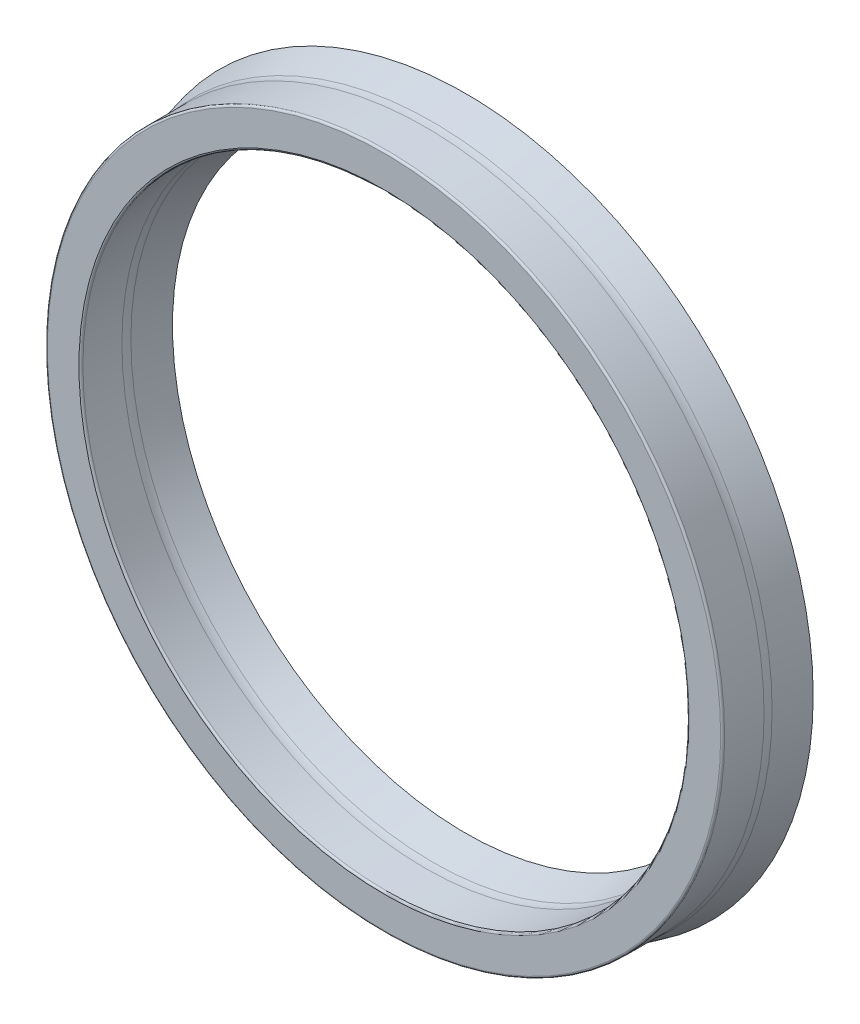
ISO-10303-21;
HEADER;
FILE_DESCRIPTION(('STEP AP214'),'2;1');
FILE_NAME('part.step','',(''),(''),'','','');
FILE_SCHEMA(('AUTOMOTIVE_DESIGN { 1 0 10303 214 1 1 1 1 }'));
ENDSEC;
DATA;
#1=APPLICATION_CONTEXT('core data for automotive mechanical design processes');
#2=APPLICATION_PROTOCOL_DEFINITION('international standard','automotive_design',2000,#1);
#3=PRODUCT_CONTEXT('',#1,'mechanical');
#4=PRODUCT('Part','Part','',(#3));
#5=PRODUCT_RELATED_PRODUCT_CATEGORY('part','',(#4));
#6=PRODUCT_DEFINITION_FORMATION('','',#4);
#7=PRODUCT_DEFINITION_CONTEXT('part definition',#1,'design');
#8=PRODUCT_DEFINITION('design','',#6,#7);
#9=PRODUCT_DEFINITION_SHAPE('','',#8);
#10=(LENGTH_UNIT() NAMED_UNIT(*) SI_UNIT(.MILLI.,.METRE.));
#11=(NAMED_UNIT(*) PLANE_ANGLE_UNIT() SI_UNIT($,.RADIAN.));
#12=(NAMED_UNIT(*) SI_UNIT($,.STERADIAN.) SOLID_ANGLE_UNIT());
#13=UNCERTAINTY_MEASURE_WITH_UNIT(LENGTH_MEASURE(1.E-05),#10,'distance_accuracy_value','');
#14=(GEOMETRIC_REPRESENTATION_CONTEXT(3) GLOBAL_UNCERTAINTY_ASSIGNED_CONTEXT((#13)) GLOBAL_UNIT_ASSIGNED_CONTEXT((#10,
#11,#12)) REPRESENTATION_CONTEXT('',''));
#15=CARTESIAN_POINT('',(0.,0.,0.));
#16=DIRECTION('',(0.,0.,1.));
#17=DIRECTION('',(1.,0.,0.));
#18=AXIS2_PLACEMENT_3D('',#15,#16,#17);
#19=CARTESIAN_POINT('',(0.,34.75,-8.15));
#20=DIRECTION('',(0.,0.,1.));
#21=DIRECTION('',(1.,0.,0.));
#22=AXIS2_PLACEMENT_3D('',#19,#20,#21);
#23=PLANE('',#22);
#24=CARTESIAN_POINT('',(0.,0.,-8.15));
#25=DIRECTION('',(0.,0.,1.));
#26=DIRECTION('',(1.,0.,0.));
#27=AXIS2_PLACEMENT_3D('',#24,#25,#26);
#28=CIRCLE('',#27,34.75);
#29=CARTESIAN_POINT('',(34.75,0.,-8.15));
#30=VERTEX_POINT('',#29);
#31=EDGE_CURVE('E10',#30,#30,#28,.T.);
#32=ORIENTED_EDGE('',*,*,#31,.F.);
#33=EDGE_LOOP('',(#32));
#34=FACE_BOUND('',#33,.T.);
#35=CARTESIAN_POINT('',(0.,0.,-8.15));
#36=DIRECTION('',(0.,0.,1.));
#37=DIRECTION('',(1.,0.,0.));
#38=AXIS2_PLACEMENT_3D('',#35,#36,#37);
#39=CIRCLE('',#38,33.5);
#40=CARTESIAN_POINT('',(33.5,0.,-8.15));
#41=VERTEX_POINT('',#40);
#42=EDGE_CURVE('E85',#41,#41,#39,.T.);
#43=ORIENTED_EDGE('',*,*,#42,.T.);
#44=EDGE_LOOP('',(#43));
#45=FACE_BOUND('',#44,.T.);
#46=ADVANCED_FACE('F39',(#34,#45),#23,.F.);
#47=CARTESIAN_POINT('',(0.,0.,-8.15));
#48=DIRECTION('',(0.,0.,-1.));
#49=DIRECTION('',(-1.,0.,0.));
#50=AXIS2_PLACEMENT_3D('',#47,#48,#49);
#51=CONICAL_SURFACE('',#50,34.75,0.241752867864243);
#52=CARTESIAN_POINT('',(0.,0.,-4.85380883804575));
#53=DIRECTION('',(0.,0.,1.));
#54=DIRECTION('',(1.,0.,0.));
#55=AXIS2_PLACEMENT_3D('',#52,#53,#54);
#56=CIRCLE('',#55,33.9372405354085);
#57=CARTESIAN_POINT('',(33.9372405354085,0.,-4.85380883804575));
#58=VERTEX_POINT('',#57);
#59=EDGE_CURVE('E45',#58,#58,#56,.T.);
#60=ORIENTED_EDGE('',*,*,#59,.F.);
#61=EDGE_LOOP('',(#60));
#62=FACE_BOUND('',#61,.T.);
#63=ORIENTED_EDGE('',*,*,#31,.T.);
#64=EDGE_LOOP('',(#63));
#65=FACE_BOUND('',#64,.T.);
#66=ADVANCED_FACE('F158',(#62,#65),#51,.T.);
#67=CARTESIAN_POINT('',(0.,0.,-4.13559417554377));
#68=DIRECTION('',(0.,0.,1.));
#69=DIRECTION('',(1.,0.,0.));
#70=AXIS2_PLACEMENT_3D('',#67,#68,#69);
#71=TOROIDAL_SURFACE('',#70,36.85,3.);
#72=CARTESIAN_POINT('',(0.,0.,-4.13559417554374));
#73=DIRECTION('',(0.,0.,1.));
#74=DIRECTION('',(1.,0.,0.));
#75=AXIS2_PLACEMENT_3D('',#72,#73,#74);
#76=CIRCLE('',#75,33.85);
#77=CARTESIAN_POINT('',(33.85,0.,-4.13559417554374));
#78=VERTEX_POINT('',#77);
#79=EDGE_CURVE('E49',#78,#78,#76,.T.);
#80=ORIENTED_EDGE('',*,*,#79,.F.);
#81=EDGE_LOOP('',(#80));
#82=FACE_BOUND('',#81,.T.);
#83=ORIENTED_EDGE('',*,*,#59,.T.);
#84=EDGE_LOOP('',(#83));
#85=FACE_BOUND('',#84,.T.);
#86=ADVANCED_FACE('F153',(#82,#85),#71,.F.);
#87=CARTESIAN_POINT('',(0.,0.,0.));
#88=DIRECTION('',(0.,0.,1.));
#89=DIRECTION('',(1.,0.,0.));
#90=AXIS2_PLACEMENT_3D('',#87,#88,#89);
#91=CYLINDRICAL_SURFACE('',#90,33.85);
#92=CARTESIAN_POINT('',(0.,0.,-0.2));
#93=DIRECTION('',(0.,0.,1.));
#94=DIRECTION('',(1.,0.,0.));
#95=AXIS2_PLACEMENT_3D('',#92,#93,#94);
#96=CIRCLE('',#95,33.85);
#97=CARTESIAN_POINT('',(33.85,0.,-0.2));
#98=VERTEX_POINT('',#97);
#99=EDGE_CURVE('E53',#98,#98,#96,.T.);
#100=ORIENTED_EDGE('',*,*,#99,.F.);
#101=EDGE_LOOP('',(#100));
#102=FACE_BOUND('',#101,.T.);
#103=ORIENTED_EDGE('',*,*,#79,.T.);
#104=EDGE_LOOP('',(#103));
#105=FACE_BOUND('',#104,.T.);
#106=ADVANCED_FACE('F147',(#102,#105),#91,.T.);
#107=CARTESIAN_POINT('',(0.,0.,-0.2));
#108=DIRECTION('',(0.,0.,1.));
#109=DIRECTION('',(1.,0.,0.));
#110=AXIS2_PLACEMENT_3D('',#107,#108,#109);
#111=TOROIDAL_SURFACE('',#110,33.65,0.199999999999999);
#112=CARTESIAN_POINT('',(0.,0.,0.));
#113=DIRECTION('',(0.,0.,1.));
#114=DIRECTION('',(1.,0.,0.));
#115=AXIS2_PLACEMENT_3D('',#112,#113,#114);
#116=CIRCLE('',#115,33.65);
#117=CARTESIAN_POINT('',(33.65,0.,0.));
#118=VERTEX_POINT('',#117);
#119=EDGE_CURVE('E58',#118,#118,#116,.T.);
#120=ORIENTED_EDGE('',*,*,#119,.F.);
#121=EDGE_LOOP('',(#120));
#122=FACE_BOUND('',#121,.T.);
#123=ORIENTED_EDGE('',*,*,#99,.T.);
#124=EDGE_LOOP('',(#123));
#125=FACE_BOUND('',#124,.T.);
#126=ADVANCED_FACE('F141',(#122,#125),#111,.T.);
#127=CARTESIAN_POINT('',(0.,30.5,0.));
#128=DIRECTION('',(0.,0.,-1.));
#129=DIRECTION('',(-1.,0.,0.));
#130=AXIS2_PLACEMENT_3D('',#127,#128,#129);
#131=PLANE('',#130);
#132=CARTESIAN_POINT('',(0.,0.,0.));
#133=DIRECTION('',(0.,0.,1.));
#134=DIRECTION('',(1.,0.,0.));
#135=AXIS2_PLACEMENT_3D('',#132,#133,#134);
#136=CIRCLE('',#135,30.5);
#137=CARTESIAN_POINT('',(30.5,0.,0.));
#138=VERTEX_POINT('',#137);
#139=EDGE_CURVE('E61',#138,#138,#136,.T.);
#140=ORIENTED_EDGE('',*,*,#139,.F.);
#141=EDGE_LOOP('',(#140));
#142=FACE_BOUND('',#141,.T.);
#143=ORIENTED_EDGE('',*,*,#119,.T.);
#144=EDGE_LOOP('',(#143));
#145=FACE_BOUND('',#144,.T.);
#146=ADVANCED_FACE('F135',(#142,#145),#131,.F.);
#147=CARTESIAN_POINT('',(0.,0.,-0.2));
#148=DIRECTION('',(0.,0.,1.));
#149=DIRECTION('',(1.,0.,0.));
#150=AXIS2_PLACEMENT_3D('',#147,#148,#149);
#151=TOROIDAL_SURFACE('',#150,30.5,0.199999999999996);
#152=CARTESIAN_POINT('',(0.,0.,-0.2));
#153=DIRECTION('',(0.,0.,1.));
#154=DIRECTION('',(1.,0.,0.));
#155=AXIS2_PLACEMENT_3D('',#152,#153,#154);
#156=CIRCLE('',#155,30.3);
#157=CARTESIAN_POINT('',(30.3,0.,-0.2));
#158=VERTEX_POINT('',#157);
#159=EDGE_CURVE('E64',#158,#158,#156,.T.);
#160=ORIENTED_EDGE('',*,*,#159,.F.);
#161=EDGE_LOOP('',(#160));
#162=FACE_BOUND('',#161,.T.);
#163=ORIENTED_EDGE('',*,*,#139,.T.);
#164=EDGE_LOOP('',(#163));
#165=FACE_BOUND('',#164,.T.);
#166=ADVANCED_FACE('F129',(#162,#165),#151,.T.);
#167=CARTESIAN_POINT('',(0.,0.,0.));
#168=DIRECTION('',(0.,0.,1.));
#169=DIRECTION('',(1.,0.,0.));
#170=AXIS2_PLACEMENT_3D('',#167,#168,#169);
#171=CYLINDRICAL_SURFACE('',#170,30.3);
#172=CARTESIAN_POINT('',(0.,0.,-4.09647631790024));
#173=DIRECTION('',(0.,0.,1.));
#174=DIRECTION('',(1.,0.,0.));
#175=AXIS2_PLACEMENT_3D('',#172,#173,#174);
#176=CIRCLE('',#175,30.3);
#177=CARTESIAN_POINT('',(30.3,0.,-4.09647631790024));
#178=VERTEX_POINT('',#177);
#179=EDGE_CURVE('E67',#178,#178,#176,.T.);
#180=ORIENTED_EDGE('',*,*,#179,.F.);
#181=EDGE_LOOP('',(#180));
#182=FACE_BOUND('',#181,.T.);
#183=ORIENTED_EDGE('',*,*,#159,.T.);
#184=EDGE_LOOP('',(#183));
#185=FACE_BOUND('',#184,.T.);
#186=ADVANCED_FACE('F123',(#182,#185),#171,.F.);
#187=CARTESIAN_POINT('',(0.,0.,-4.09647631790024));
#188=DIRECTION('',(0.,0.,1.));
#189=DIRECTION('',(1.,0.,0.));
#190=AXIS2_PLACEMENT_3D('',#187,#188,#189);
#191=TOROIDAL_SURFACE('',#190,27.3,3.);
#192=CARTESIAN_POINT('',(0.,0.,-4.88918175913604));
#193=DIRECTION('',(0.,0.,1.));
#194=DIRECTION('',(1.,0.,0.));
#195=AXIS2_PLACEMENT_3D('',#192,#193,#194);
#196=CIRCLE('',#195,30.1933748605107);
#197=CARTESIAN_POINT('',(30.1933748605107,0.,-4.88918175913604));
#198=VERTEX_POINT('',#197);
#199=EDGE_CURVE('E70',#198,#198,#196,.T.);
#200=ORIENTED_EDGE('',*,*,#199,.F.);
#201=EDGE_LOOP('',(#200));
#202=FACE_BOUND('',#201,.T.);
#203=ORIENTED_EDGE('',*,*,#179,.T.);
#204=EDGE_LOOP('',(#203));
#205=FACE_BOUND('',#204,.T.);
#206=ADVANCED_FACE('F117',(#202,#205),#191,.F.);
#207=CARTESIAN_POINT('',(0.,0.,-4.88918175913604));
#208=DIRECTION('',(0.,0.,1.));
#209=DIRECTION('',(1.,0.,0.));
#210=AXIS2_PLACEMENT_3D('',#207,#208,#209);
#211=CONICAL_SURFACE('',#210,30.1933748605107,0.267410797183873);
#212=CARTESIAN_POINT('',(0.,0.,-8.15));
#213=DIRECTION('',(0.,0.,1.));
#214=DIRECTION('',(1.,0.,0.));
#215=AXIS2_PLACEMENT_3D('',#212,#213,#214);
#216=CIRCLE('',#215,29.3);
#217=CARTESIAN_POINT('',(29.3,0.,-8.15));
#218=VERTEX_POINT('',#217);
#219=EDGE_CURVE('E73',#218,#218,#216,.T.);
#220=ORIENTED_EDGE('',*,*,#219,.F.);
#221=EDGE_LOOP('',(#220));
#222=FACE_BOUND('',#221,.T.);
#223=ORIENTED_EDGE('',*,*,#199,.T.);
#224=EDGE_LOOP('',(#223));
#225=FACE_BOUND('',#224,.T.);
#226=ADVANCED_FACE('F111',(#222,#225),#211,.F.);
#227=CARTESIAN_POINT('',(0.,30.75,-8.15));
#228=DIRECTION('',(0.,0.,1.));
#229=DIRECTION('',(1.,0.,0.));
#230=AXIS2_PLACEMENT_3D('',#227,#228,#229);
#231=PLANE('',#230);
#232=CARTESIAN_POINT('',(0.,0.,-8.15));
#233=DIRECTION('',(0.,0.,1.));
#234=DIRECTION('',(1.,0.,0.));
#235=AXIS2_PLACEMENT_3D('',#232,#233,#234);
#236=CIRCLE('',#235,30.75);
#237=CARTESIAN_POINT('',(30.75,0.,-8.15));
#238=VERTEX_POINT('',#237);
#239=EDGE_CURVE('E76',#238,#238,#236,.T.);
#240=ORIENTED_EDGE('',*,*,#239,.F.);
#241=EDGE_LOOP('',(#240));
#242=FACE_BOUND('',#241,.T.);
#243=ORIENTED_EDGE('',*,*,#219,.T.);
#244=EDGE_LOOP('',(#243));
#245=FACE_BOUND('',#244,.T.);
#246=ADVANCED_FACE('F105',(#242,#245),#231,.F.);
#247=CARTESIAN_POINT('',(0.,0.,-8.15));
#248=DIRECTION('',(0.,0.,1.));
#249=DIRECTION('',(1.,0.,0.));
#250=AXIS2_PLACEMENT_3D('',#247,#248,#249);
#251=CONICAL_SURFACE('',#250,30.75,0.255057918494361);
#252=CARTESIAN_POINT('',(0.,0.,-4.9238492730938));
#253=DIRECTION('',(0.,0.,1.));
#254=DIRECTION('',(1.,0.,0.));
#255=AXIS2_PLACEMENT_3D('',#252,#253,#254);
#256=CIRCLE('',#255,31.5911756578044);
#257=CARTESIAN_POINT('',(31.5911756578044,0.,-4.9238492730938));
#258=VERTEX_POINT('',#257);
#259=EDGE_CURVE('E79',#258,#258,#256,.T.);
#260=ORIENTED_EDGE('',*,*,#259,.F.);
#261=EDGE_LOOP('',(#260));
#262=FACE_BOUND('',#261,.T.);
#263=ORIENTED_EDGE('',*,*,#239,.T.);
#264=EDGE_LOOP('',(#263));
#265=FACE_BOUND('',#264,.T.);
#266=ADVANCED_FACE('F99',(#262,#265),#251,.T.);
#267=CARTESIAN_POINT('',(0.,0.,-5.05));
#268=DIRECTION('',(0.,0.,1.));
#269=DIRECTION('',(1.,0.,0.));
#270=AXIS2_PLACEMENT_3D('',#267,#268,#269);
#271=TOROIDAL_SURFACE('',#270,32.075,0.5);
#272=CARTESIAN_POINT('',(0.,0.,-4.91));
#273=DIRECTION('',(0.,0.,1.));
#274=DIRECTION('',(1.,0.,0.));
#275=AXIS2_PLACEMENT_3D('',#272,#273,#274);
#276=CIRCLE('',#275,32.555);
#277=CARTESIAN_POINT('',(32.555,0.,-4.91));
#278=VERTEX_POINT('',#277);
#279=EDGE_CURVE('E82',#278,#278,#276,.T.);
#280=ORIENTED_EDGE('',*,*,#279,.F.);
#281=EDGE_LOOP('',(#280));
#282=FACE_BOUND('',#281,.T.);
#283=ORIENTED_EDGE('',*,*,#259,.T.);
#284=EDGE_LOOP('',(#283));
#285=FACE_BOUND('',#284,.T.);
#286=ADVANCED_FACE('F93',(#282,#285),#271,.F.);
#287=CARTESIAN_POINT('',(0.,0.,-4.91));
#288=DIRECTION('',(0.,0.,-1.));
#289=DIRECTION('',(-1.,0.,0.));
#290=AXIS2_PLACEMENT_3D('',#287,#288,#289);
#291=CONICAL_SURFACE('',#290,32.555,0.283794109208328);
#292=ORIENTED_EDGE('',*,*,#42,.F.);
#293=EDGE_LOOP('',(#292));
#294=FACE_BOUND('',#293,.T.);
#295=ORIENTED_EDGE('',*,*,#279,.T.);
#296=EDGE_LOOP('',(#295));
#297=FACE_BOUND('',#296,.T.);
#298=ADVANCED_FACE('F90',(#294,#297),#291,.F.);
#299=CLOSED_SHELL('',(#46,#66,#86,#106,#126,#146,#166,#186,#206,#226,#246,#266,#286,#298));
#300=MANIFOLD_SOLID_BREP('B2',#299);
#301=ADVANCED_BREP_SHAPE_REPRESENTATION('',(#18,#300),#14);
#302=SHAPE_DEFINITION_REPRESENTATION(#9,#301);
ENDSEC;
END-ISO-10303-21;
